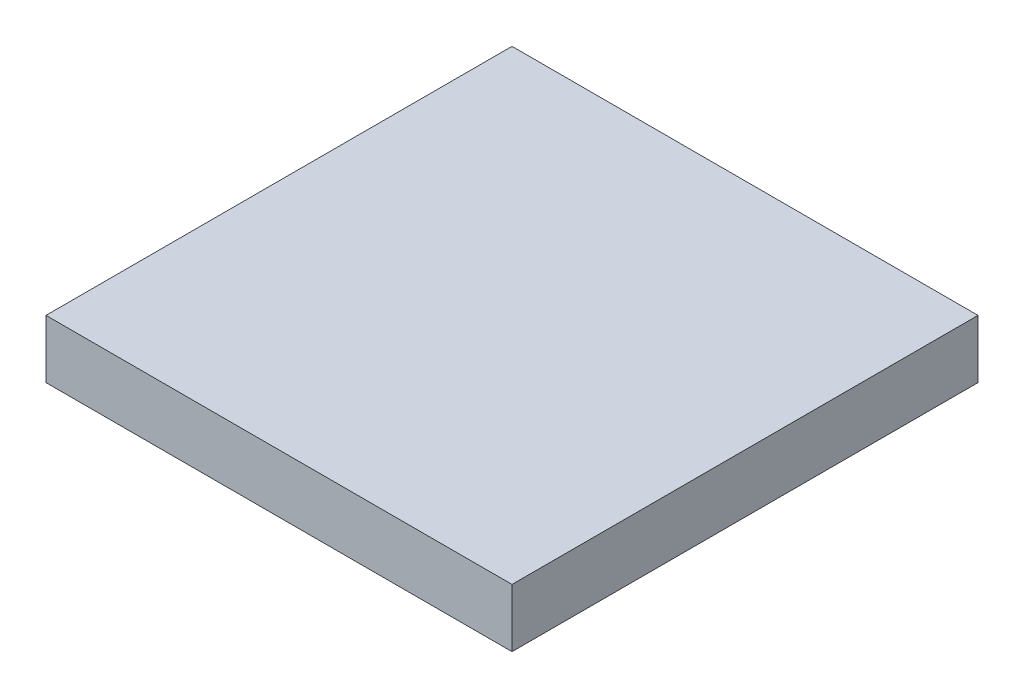
ISO-10303-21;
HEADER;
FILE_DESCRIPTION(('STEP AP214'),'2;1');
FILE_NAME('part.step','',(''),(''),'','','');
FILE_SCHEMA(('AUTOMOTIVE_DESIGN { 1 0 10303 214 1 1 1 1 }'));
ENDSEC;
DATA;
#1=APPLICATION_CONTEXT('core data for automotive mechanical design processes');
#2=APPLICATION_PROTOCOL_DEFINITION('international standard','automotive_design',2000,#1);
#3=PRODUCT_CONTEXT('',#1,'mechanical');
#4=PRODUCT('Part','Part','',(#3));
#5=PRODUCT_RELATED_PRODUCT_CATEGORY('part','',(#4));
#6=PRODUCT_DEFINITION_FORMATION('','',#4);
#7=PRODUCT_DEFINITION_CONTEXT('part definition',#1,'design');
#8=PRODUCT_DEFINITION('design','',#6,#7);
#9=PRODUCT_DEFINITION_SHAPE('','',#8);
#10=(LENGTH_UNIT() NAMED_UNIT(*) SI_UNIT(.MILLI.,.METRE.));
#11=(NAMED_UNIT(*) PLANE_ANGLE_UNIT() SI_UNIT($,.RADIAN.));
#12=(NAMED_UNIT(*) SI_UNIT($,.STERADIAN.) SOLID_ANGLE_UNIT());
#13=UNCERTAINTY_MEASURE_WITH_UNIT(LENGTH_MEASURE(1.E-05),#10,'distance_accuracy_value','');
#14=(GEOMETRIC_REPRESENTATION_CONTEXT(3) GLOBAL_UNCERTAINTY_ASSIGNED_CONTEXT((#13)) GLOBAL_UNIT_ASSIGNED_CONTEXT((#10,
#11,#12)) REPRESENTATION_CONTEXT('',''));
#15=CARTESIAN_POINT('',(0.,0.,0.));
#16=DIRECTION('',(0.,0.,1.));
#17=DIRECTION('',(1.,0.,0.));
#18=AXIS2_PLACEMENT_3D('',#15,#16,#17);
#19=CARTESIAN_POINT('',(1219.2,304.8,1219.2));
#20=DIRECTION('',(-1.,0.,0.));
#21=DIRECTION('',(0.,0.,1.));
#22=AXIS2_PLACEMENT_3D('',#19,#20,#21);
#23=PLANE('',#22);
#24=DIRECTION('',(0.,0.,-1.));
#25=VECTOR('',#24,1.);
#26=CARTESIAN_POINT('',(1219.2,0.,1219.2));
#27=LINE('',#26,#25);
#28=CARTESIAN_POINT('',(1219.2,0.,1219.2));
#29=VERTEX_POINT('',#28);
#30=CARTESIAN_POINT('',(1219.2,0.,-1219.2));
#31=VERTEX_POINT('',#30);
#32=EDGE_CURVE('E107',#29,#31,#27,.T.);
#33=ORIENTED_EDGE('',*,*,#32,.T.);
#34=DIRECTION('',(0.,-1.,0.));
#35=VECTOR('',#34,1.);
#36=CARTESIAN_POINT('',(1219.2,304.8,-1219.2));
#37=LINE('',#36,#35);
#38=CARTESIAN_POINT('',(1219.2,304.8,-1219.2));
#39=VERTEX_POINT('',#38);
#40=EDGE_CURVE('E11',#39,#31,#37,.T.);
#41=ORIENTED_EDGE('',*,*,#40,.F.);
#42=DIRECTION('',(0.,0.,-1.));
#43=VECTOR('',#42,1.);
#44=CARTESIAN_POINT('',(1219.2,304.8,1219.2));
#45=LINE('',#44,#43);
#46=CARTESIAN_POINT('',(1219.2,304.8,1219.2));
#47=VERTEX_POINT('',#46);
#48=EDGE_CURVE('E91',#47,#39,#45,.T.);
#49=ORIENTED_EDGE('',*,*,#48,.F.);
#50=DIRECTION('',(0.,-1.,0.));
#51=VECTOR('',#50,1.);
#52=CARTESIAN_POINT('',(1219.2,304.8,1219.2));
#53=LINE('',#52,#51);
#54=EDGE_CURVE('E103',#47,#29,#53,.T.);
#55=ORIENTED_EDGE('',*,*,#54,.T.);
#56=EDGE_LOOP('',(#33,#41,#49,#55));
#57=FACE_BOUND('',#56,.T.);
#58=ADVANCED_FACE('F39',(#57),#23,.F.);
#59=CARTESIAN_POINT('',(-1219.2,304.8,-1219.2));
#60=DIRECTION('',(0.,0.,1.));
#61=DIRECTION('',(1.,0.,0.));
#62=AXIS2_PLACEMENT_3D('',#59,#60,#61);
#63=PLANE('',#62);
#64=DIRECTION('',(-1.,0.,0.));
#65=VECTOR('',#64,1.);
#66=CARTESIAN_POINT('',(-1219.2,0.,-1219.2));
#67=LINE('',#66,#65);
#68=CARTESIAN_POINT('',(-1219.2,0.,-1219.2));
#69=VERTEX_POINT('',#68);
#70=EDGE_CURVE('E96',#31,#69,#67,.T.);
#71=ORIENTED_EDGE('',*,*,#70,.T.);
#72=DIRECTION('',(0.,-1.,0.));
#73=VECTOR('',#72,1.);
#74=CARTESIAN_POINT('',(-1219.2,304.8,-1219.2));
#75=LINE('',#74,#73);
#76=CARTESIAN_POINT('',(-1219.2,304.8,-1219.2));
#77=VERTEX_POINT('',#76);
#78=EDGE_CURVE('E48',#77,#69,#75,.T.);
#79=ORIENTED_EDGE('',*,*,#78,.F.);
#80=DIRECTION('',(-1.,0.,0.));
#81=VECTOR('',#80,1.);
#82=CARTESIAN_POINT('',(-1219.2,304.8,-1219.2));
#83=LINE('',#82,#81);
#84=EDGE_CURVE('E86',#39,#77,#83,.T.);
#85=ORIENTED_EDGE('',*,*,#84,.F.);
#86=ORIENTED_EDGE('',*,*,#40,.T.);
#87=EDGE_LOOP('',(#71,#79,#85,#86));
#88=FACE_BOUND('',#87,.T.);
#89=ADVANCED_FACE('F95',(#88),#63,.F.);
#90=CARTESIAN_POINT('',(-1219.2,304.8,1219.2));
#91=DIRECTION('',(1.,0.,0.));
#92=DIRECTION('',(0.,0.,-1.));
#93=AXIS2_PLACEMENT_3D('',#90,#91,#92);
#94=PLANE('',#93);
#95=DIRECTION('',(0.,0.,1.));
#96=VECTOR('',#95,1.);
#97=CARTESIAN_POINT('',(-1219.2,0.,1219.2));
#98=LINE('',#97,#96);
#99=CARTESIAN_POINT('',(-1219.2,0.,1219.2));
#100=VERTEX_POINT('',#99);
#101=EDGE_CURVE('E73',#69,#100,#98,.T.);
#102=ORIENTED_EDGE('',*,*,#101,.T.);
#103=DIRECTION('',(0.,-1.,0.));
#104=VECTOR('',#103,1.);
#105=CARTESIAN_POINT('',(-1219.2,304.8,1219.2));
#106=LINE('',#105,#104);
#107=CARTESIAN_POINT('',(-1219.2,304.8,1219.2));
#108=VERTEX_POINT('',#107);
#109=EDGE_CURVE('E98',#108,#100,#106,.T.);
#110=ORIENTED_EDGE('',*,*,#109,.F.);
#111=DIRECTION('',(0.,0.,1.));
#112=VECTOR('',#111,1.);
#113=CARTESIAN_POINT('',(-1219.2,304.8,1219.2));
#114=LINE('',#113,#112);
#115=EDGE_CURVE('E89',#77,#108,#114,.T.);
#116=ORIENTED_EDGE('',*,*,#115,.F.);
#117=ORIENTED_EDGE('',*,*,#78,.T.);
#118=EDGE_LOOP('',(#102,#110,#116,#117));
#119=FACE_BOUND('',#118,.T.);
#120=ADVANCED_FACE('F99',(#119),#94,.F.);
#121=CARTESIAN_POINT('',(-1219.2,304.8,1219.2));
#122=DIRECTION('',(0.,0.,-1.));
#123=DIRECTION('',(-1.,0.,0.));
#124=AXIS2_PLACEMENT_3D('',#121,#122,#123);
#125=PLANE('',#124);
#126=DIRECTION('',(1.,0.,0.));
#127=VECTOR('',#126,1.);
#128=CARTESIAN_POINT('',(-1219.2,0.,1219.2));
#129=LINE('',#128,#127);
#130=EDGE_CURVE('E79',#100,#29,#129,.T.);
#131=ORIENTED_EDGE('',*,*,#130,.T.);
#132=ORIENTED_EDGE('',*,*,#54,.F.);
#133=DIRECTION('',(1.,0.,0.));
#134=VECTOR('',#133,1.);
#135=CARTESIAN_POINT('',(-1219.2,304.8,1219.2));
#136=LINE('',#135,#134);
#137=EDGE_CURVE('E56',#108,#47,#136,.T.);
#138=ORIENTED_EDGE('',*,*,#137,.F.);
#139=ORIENTED_EDGE('',*,*,#109,.T.);
#140=EDGE_LOOP('',(#131,#132,#138,#139));
#141=FACE_BOUND('',#140,.T.);
#142=ADVANCED_FACE('F120',(#141),#125,.F.);
#143=CARTESIAN_POINT('',(0.,304.8,0.));
#144=DIRECTION('',(0.,-1.,0.));
#145=DIRECTION('',(0.,0.,-1.));
#146=AXIS2_PLACEMENT_3D('',#143,#144,#145);
#147=PLANE('',#146);
#148=ORIENTED_EDGE('',*,*,#48,.T.);
#149=ORIENTED_EDGE('',*,*,#84,.T.);
#150=ORIENTED_EDGE('',*,*,#115,.T.);
#151=ORIENTED_EDGE('',*,*,#137,.T.);
#152=EDGE_LOOP('',(#148,#149,#150,#151));
#153=FACE_BOUND('',#152,.T.);
#154=ADVANCED_FACE('F87',(#153),#147,.F.);
#155=CARTESIAN_POINT('',(0.,0.,0.));
#156=DIRECTION('',(0.,-1.,0.));
#157=DIRECTION('',(0.,0.,-1.));
#158=AXIS2_PLACEMENT_3D('',#155,#156,#157);
#159=PLANE('',#158);
#160=ORIENTED_EDGE('',*,*,#32,.F.);
#161=ORIENTED_EDGE('',*,*,#130,.F.);
#162=ORIENTED_EDGE('',*,*,#101,.F.);
#163=ORIENTED_EDGE('',*,*,#70,.F.);
#164=EDGE_LOOP('',(#160,#161,#162,#163));
#165=FACE_BOUND('',#164,.T.);
#166=ADVANCED_FACE('F123',(#165),#159,.T.);
#167=CLOSED_SHELL('',(#58,#89,#120,#142,#154,#166));
#168=MANIFOLD_SOLID_BREP('B2',#167);
#169=ADVANCED_BREP_SHAPE_REPRESENTATION('',(#18,#168),#14);
#170=SHAPE_DEFINITION_REPRESENTATION(#9,#169);
ENDSEC;
END-ISO-10303-21;
